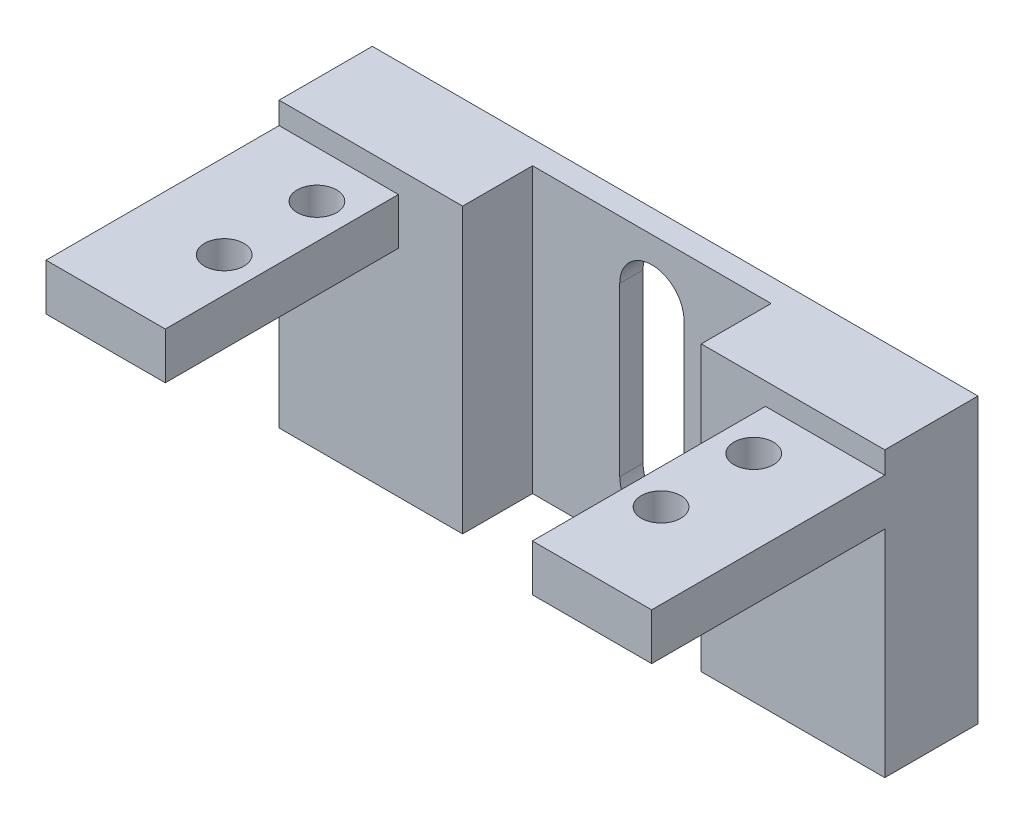
ISO-10303-21;
HEADER;
FILE_DESCRIPTION(('STEP AP214'),'2;1');
FILE_NAME('part.step','',(''),(''),'','','');
FILE_SCHEMA(('AUTOMOTIVE_DESIGN { 1 0 10303 214 1 1 1 1 }'));
ENDSEC;
DATA;
#1=APPLICATION_CONTEXT('core data for automotive mechanical design processes');
#2=APPLICATION_PROTOCOL_DEFINITION('international standard','automotive_design',2000,#1);
#3=PRODUCT_CONTEXT('',#1,'mechanical');
#4=PRODUCT('Part','Part','',(#3));
#5=PRODUCT_RELATED_PRODUCT_CATEGORY('part','',(#4));
#6=PRODUCT_DEFINITION_FORMATION('','',#4);
#7=PRODUCT_DEFINITION_CONTEXT('part definition',#1,'design');
#8=PRODUCT_DEFINITION('design','',#6,#7);
#9=PRODUCT_DEFINITION_SHAPE('','',#8);
#10=(LENGTH_UNIT() NAMED_UNIT(*) SI_UNIT(.MILLI.,.METRE.));
#11=(NAMED_UNIT(*) PLANE_ANGLE_UNIT() SI_UNIT($,.RADIAN.));
#12=(NAMED_UNIT(*) SI_UNIT($,.STERADIAN.) SOLID_ANGLE_UNIT());
#13=UNCERTAINTY_MEASURE_WITH_UNIT(LENGTH_MEASURE(1.E-05),#10,'distance_accuracy_value','');
#14=(GEOMETRIC_REPRESENTATION_CONTEXT(3) GLOBAL_UNCERTAINTY_ASSIGNED_CONTEXT((#13)) GLOBAL_UNIT_ASSIGNED_CONTEXT((#10,
#11,#12)) REPRESENTATION_CONTEXT('',''));
#15=CARTESIAN_POINT('',(0.,0.,0.));
#16=DIRECTION('',(0.,0.,1.));
#17=DIRECTION('',(1.,0.,0.));
#18=AXIS2_PLACEMENT_3D('',#15,#16,#17);
#19=CARTESIAN_POINT('',(0.,2.54,-27.619999878));
#20=DIRECTION('',(0.,0.,-1.));
#21=DIRECTION('',(-1.,0.,0.));
#22=AXIS2_PLACEMENT_3D('',#19,#20,#21);
#23=PLANE('',#22);
#24=DIRECTION('',(1.,0.,0.));
#25=VECTOR('',#24,1.);
#26=CARTESIAN_POINT('',(0.,0.,-27.619999878));
#27=LINE('',#26,#25);
#28=CARTESIAN_POINT('',(0.,0.,-27.619999878));
#29=VERTEX_POINT('',#28);
#30=CARTESIAN_POINT('',(66.,0.,-27.619999878));
#31=VERTEX_POINT('',#30);
#32=EDGE_CURVE('E347',#29,#31,#27,.T.);
#33=ORIENTED_EDGE('',*,*,#32,.F.);
#34=DIRECTION('',(0.,-1.,0.));
#35=VECTOR('',#34,1.);
#36=CARTESIAN_POINT('',(0.,2.54,-27.619999878));
#37=LINE('',#36,#35);
#38=CARTESIAN_POINT('',(0.,30.94,-27.619999878));
#39=VERTEX_POINT('',#38);
#40=EDGE_CURVE('E46',#39,#29,#37,.T.);
#41=ORIENTED_EDGE('',*,*,#40,.F.);
#42=DIRECTION('',(-1.,0.,0.));
#43=VECTOR('',#42,1.);
#44=CARTESIAN_POINT('',(0.,30.94,-27.619999878));
#45=LINE('',#44,#43);
#46=CARTESIAN_POINT('',(66.,30.94,-27.619999878));
#47=VERTEX_POINT('',#46);
#48=EDGE_CURVE('E234',#47,#39,#45,.T.);
#49=ORIENTED_EDGE('',*,*,#48,.F.);
#50=DIRECTION('',(0.,-1.,0.));
#51=VECTOR('',#50,1.);
#52=CARTESIAN_POINT('',(66.,2.54,-27.619999878));
#53=LINE('',#52,#51);
#54=EDGE_CURVE('E51',#47,#31,#53,.T.);
#55=ORIENTED_EDGE('',*,*,#54,.T.);
#56=EDGE_LOOP('',(#33,#41,#49,#55));
#57=FACE_BOUND('',#56,.T.);
#58=CARTESIAN_POINT('',(33.,6.35,-27.619999878));
#59=DIRECTION('',(0.,0.,-1.));
#60=DIRECTION('',(-1.,0.,0.));
#61=AXIS2_PLACEMENT_3D('',#58,#59,#60);
#62=CIRCLE('',#61,3.5);
#63=CARTESIAN_POINT('',(36.5,6.35,-27.619999878));
#64=VERTEX_POINT('',#63);
#65=CARTESIAN_POINT('',(29.5,6.35,-27.619999878));
#66=VERTEX_POINT('',#65);
#67=EDGE_CURVE('E196',#64,#66,#62,.T.);
#68=ORIENTED_EDGE('',*,*,#67,.F.);
#69=DIRECTION('',(0.,-1.,0.));
#70=VECTOR('',#69,1.);
#71=CARTESIAN_POINT('',(36.5,24.59,-27.619999878));
#72=LINE('',#71,#70);
#73=CARTESIAN_POINT('',(36.5,24.59,-27.619999878));
#74=VERTEX_POINT('',#73);
#75=EDGE_CURVE('E191',#74,#64,#72,.T.);
#76=ORIENTED_EDGE('',*,*,#75,.F.);
#77=CARTESIAN_POINT('',(33.,24.59,-27.619999878));
#78=DIRECTION('',(0.,0.,-1.));
#79=DIRECTION('',(-1.,0.,0.));
#80=AXIS2_PLACEMENT_3D('',#77,#78,#79);
#81=CIRCLE('',#80,3.5);
#82=CARTESIAN_POINT('',(29.5,24.59,-27.619999878));
#83=VERTEX_POINT('',#82);
#84=EDGE_CURVE('E180',#74,#83,#81,.F.);
#85=ORIENTED_EDGE('',*,*,#84,.T.);
#86=DIRECTION('',(0.,-1.,0.));
#87=VECTOR('',#86,1.);
#88=CARTESIAN_POINT('',(29.5,24.59,-27.619999878));
#89=LINE('',#88,#87);
#90=EDGE_CURVE('E200',#83,#66,#89,.T.);
#91=ORIENTED_EDGE('',*,*,#90,.T.);
#92=EDGE_LOOP('',(#68,#76,#85,#91));
#93=FACE_BOUND('',#92,.T.);
#94=ADVANCED_FACE('F42',(#57,#93),#23,.T.);
#95=CARTESIAN_POINT('',(20.,28.54,-25.079999878));
#96=DIRECTION('',(0.,0.,-1.));
#97=DIRECTION('',(-1.,0.,0.));
#98=AXIS2_PLACEMENT_3D('',#95,#96,#97);
#99=PLANE('',#98);
#100=DIRECTION('',(0.,-1.,0.));
#101=VECTOR('',#100,1.);
#102=CARTESIAN_POINT('',(20.,28.54,-25.079999878));
#103=LINE('',#102,#101);
#104=CARTESIAN_POINT('',(20.,30.94,-25.079999878));
#105=VERTEX_POINT('',#104);
#106=CARTESIAN_POINT('',(20.,0.,-25.079999878));
#107=VERTEX_POINT('',#106);
#108=EDGE_CURVE('E339',#105,#107,#103,.T.);
#109=ORIENTED_EDGE('',*,*,#108,.T.);
#110=DIRECTION('',(-1.,0.,0.));
#111=VECTOR('',#110,1.);
#112=CARTESIAN_POINT('',(20.,0.,-25.079999878));
#113=LINE('',#112,#111);
#114=CARTESIAN_POINT('',(46.,0.,-25.079999878));
#115=VERTEX_POINT('',#114);
#116=EDGE_CURVE('E275',#115,#107,#113,.T.);
#117=ORIENTED_EDGE('',*,*,#116,.F.);
#118=DIRECTION('',(0.,-1.,0.));
#119=VECTOR('',#118,1.);
#120=CARTESIAN_POINT('',(46.,28.54,-25.079999878));
#121=LINE('',#120,#119);
#122=CARTESIAN_POINT('',(46.,30.94,-25.079999878));
#123=VERTEX_POINT('',#122);
#124=EDGE_CURVE('E337',#123,#115,#121,.T.);
#125=ORIENTED_EDGE('',*,*,#124,.F.);
#126=DIRECTION('',(1.,0.,0.));
#127=VECTOR('',#126,1.);
#128=CARTESIAN_POINT('',(20.,30.94,-25.079999878));
#129=LINE('',#128,#127);
#130=EDGE_CURVE('E223',#105,#123,#129,.T.);
#131=ORIENTED_EDGE('',*,*,#130,.F.);
#132=EDGE_LOOP('',(#109,#117,#125,#131));
#133=FACE_BOUND('',#132,.T.);
#134=DIRECTION('',(0.,-1.,0.));
#135=VECTOR('',#134,1.);
#136=CARTESIAN_POINT('',(36.5,24.59,-25.079999878));
#137=LINE('',#136,#135);
#138=CARTESIAN_POINT('',(36.5,24.59,-25.079999878));
#139=VERTEX_POINT('',#138);
#140=CARTESIAN_POINT('',(36.5,6.35,-25.079999878));
#141=VERTEX_POINT('',#140);
#142=EDGE_CURVE('E67',#139,#141,#137,.T.);
#143=ORIENTED_EDGE('',*,*,#142,.T.);
#144=CARTESIAN_POINT('',(33.,6.35,-25.079999878));
#145=DIRECTION('',(0.,0.,-1.));
#146=DIRECTION('',(-1.,0.,0.));
#147=AXIS2_PLACEMENT_3D('',#144,#145,#146);
#148=CIRCLE('',#147,3.5);
#149=CARTESIAN_POINT('',(29.5,6.35,-25.079999878));
#150=VERTEX_POINT('',#149);
#151=EDGE_CURVE('E198',#141,#150,#148,.T.);
#152=ORIENTED_EDGE('',*,*,#151,.T.);
#153=DIRECTION('',(0.,-1.,0.));
#154=VECTOR('',#153,1.);
#155=CARTESIAN_POINT('',(29.5,24.59,-25.079999878));
#156=LINE('',#155,#154);
#157=CARTESIAN_POINT('',(29.5,24.59,-25.079999878));
#158=VERTEX_POINT('',#157);
#159=EDGE_CURVE('E206',#158,#150,#156,.T.);
#160=ORIENTED_EDGE('',*,*,#159,.F.);
#161=CARTESIAN_POINT('',(33.,24.59,-25.079999878));
#162=DIRECTION('',(0.,0.,1.));
#163=DIRECTION('',(1.,0.,0.));
#164=AXIS2_PLACEMENT_3D('',#161,#162,#163);
#165=CIRCLE('',#164,3.5);
#166=EDGE_CURVE('E193',#139,#158,#165,.T.);
#167=ORIENTED_EDGE('',*,*,#166,.F.);
#168=EDGE_LOOP('',(#143,#152,#160,#167));
#169=FACE_BOUND('',#168,.T.);
#170=ADVANCED_FACE('F405',(#133,#169),#99,.F.);
#171=CARTESIAN_POINT('',(0.,28.54,0.));
#172=DIRECTION('',(0.,1.,0.));
#173=DIRECTION('',(0.,0.,1.));
#174=AXIS2_PLACEMENT_3D('',#171,#172,#173);
#175=PLANE('',#174);
#176=DIRECTION('',(1.,0.,0.));
#177=VECTOR('',#176,1.);
#178=CARTESIAN_POINT('',(46.,28.54,-17.459999878));
#179=LINE('',#178,#177);
#180=CARTESIAN_POINT('',(53.,28.54,-17.459999878));
#181=VERTEX_POINT('',#180);
#182=CARTESIAN_POINT('',(66.,28.54,-17.459999878));
#183=VERTEX_POINT('',#182);
#184=EDGE_CURVE('E11',#181,#183,#179,.T.);
#185=ORIENTED_EDGE('',*,*,#184,.F.);
#186=DIRECTION('',(0.,0.,-1.));
#187=VECTOR('',#186,1.);
#188=CARTESIAN_POINT('',(53.,28.54,7.940000122));
#189=LINE('',#188,#187);
#190=CARTESIAN_POINT('',(53.,28.54,7.940000122));
#191=VERTEX_POINT('',#190);
#192=EDGE_CURVE('E284',#191,#181,#189,.T.);
#193=ORIENTED_EDGE('',*,*,#192,.F.);
#194=DIRECTION('',(-1.,0.,0.));
#195=VECTOR('',#194,1.);
#196=CARTESIAN_POINT('',(66.,28.54,7.940000122));
#197=LINE('',#196,#195);
#198=CARTESIAN_POINT('',(66.,28.54,7.940000122));
#199=VERTEX_POINT('',#198);
#200=EDGE_CURVE('E305',#199,#191,#197,.T.);
#201=ORIENTED_EDGE('',*,*,#200,.F.);
#202=DIRECTION('',(0.,0.,1.));
#203=VECTOR('',#202,1.);
#204=CARTESIAN_POINT('',(66.,28.54,-27.619999878));
#205=LINE('',#204,#203);
#206=EDGE_CURVE('E331',#183,#199,#205,.T.);
#207=ORIENTED_EDGE('',*,*,#206,.F.);
#208=EDGE_LOOP('',(#185,#193,#201,#207));
#209=FACE_BOUND('',#208,.T.);
#210=CARTESIAN_POINT('',(56.8,28.54,-2.279999878));
#211=DIRECTION('',(0.,1.,0.));
#212=DIRECTION('',(0.,0.,1.));
#213=AXIS2_PLACEMENT_3D('',#210,#211,#212);
#214=CIRCLE('',#213,2.15);
#215=CARTESIAN_POINT('',(56.8,28.54,-0.129999877999994));
#216=VERTEX_POINT('',#215);
#217=EDGE_CURVE('E262',#216,#216,#214,.T.);
#218=ORIENTED_EDGE('',*,*,#217,.F.);
#219=EDGE_LOOP('',(#218));
#220=FACE_BOUND('',#219,.T.);
#221=CARTESIAN_POINT('',(56.8,28.54,-12.379999878));
#222=DIRECTION('',(0.,1.,0.));
#223=DIRECTION('',(0.,0.,1.));
#224=AXIS2_PLACEMENT_3D('',#221,#222,#223);
#225=CIRCLE('',#224,2.15);
#226=CARTESIAN_POINT('',(56.8,28.54,-10.229999878));
#227=VERTEX_POINT('',#226);
#228=EDGE_CURVE('E258',#227,#227,#225,.T.);
#229=ORIENTED_EDGE('',*,*,#228,.F.);
#230=EDGE_LOOP('',(#229));
#231=FACE_BOUND('',#230,.T.);
#232=ADVANCED_FACE('F412',(#209,#220,#231),#175,.T.);
#233=CARTESIAN_POINT('',(66.,28.54,-17.459999878));
#234=DIRECTION('',(0.,0.,1.));
#235=DIRECTION('',(1.,0.,0.));
#236=AXIS2_PLACEMENT_3D('',#233,#234,#235);
#237=PLANE('',#236);
#238=DIRECTION('',(1.,0.,0.));
#239=VECTOR('',#238,1.);
#240=CARTESIAN_POINT('',(66.,23.46,-17.459999878));
#241=LINE('',#240,#239);
#242=CARTESIAN_POINT('',(53.,23.46,-17.459999878));
#243=VERTEX_POINT('',#242);
#244=CARTESIAN_POINT('',(66.,23.46,-17.459999878));
#245=VERTEX_POINT('',#244);
#246=EDGE_CURVE('E294',#243,#245,#241,.T.);
#247=ORIENTED_EDGE('',*,*,#246,.F.);
#248=DIRECTION('',(0.,-1.,0.));
#249=VECTOR('',#248,1.);
#250=CARTESIAN_POINT('',(53.,28.54,-17.459999878));
#251=LINE('',#250,#249);
#252=EDGE_CURVE('E297',#181,#243,#251,.T.);
#253=ORIENTED_EDGE('',*,*,#252,.F.);
#254=ORIENTED_EDGE('',*,*,#184,.T.);
#255=DIRECTION('',(0.,-1.,0.));
#256=VECTOR('',#255,1.);
#257=CARTESIAN_POINT('',(66.,30.94,-17.459999878));
#258=LINE('',#257,#256);
#259=CARTESIAN_POINT('',(66.,30.94,-17.459999878));
#260=VERTEX_POINT('',#259);
#261=EDGE_CURVE('E237',#260,#183,#258,.T.);
#262=ORIENTED_EDGE('',*,*,#261,.F.);
#263=DIRECTION('',(1.,0.,0.));
#264=VECTOR('',#263,1.);
#265=CARTESIAN_POINT('',(46.,30.94,-17.459999878));
#266=LINE('',#265,#264);
#267=CARTESIAN_POINT('',(46.,30.94,-17.459999878));
#268=VERTEX_POINT('',#267);
#269=EDGE_CURVE('E229',#268,#260,#266,.T.);
#270=ORIENTED_EDGE('',*,*,#269,.F.);
#271=DIRECTION('',(0.,-1.,0.));
#272=VECTOR('',#271,1.);
#273=CARTESIAN_POINT('',(46.,28.54,-17.459999878));
#274=LINE('',#273,#272);
#275=CARTESIAN_POINT('',(46.,0.,-17.459999878));
#276=VERTEX_POINT('',#275);
#277=EDGE_CURVE('E335',#268,#276,#274,.T.);
#278=ORIENTED_EDGE('',*,*,#277,.T.);
#279=DIRECTION('',(-1.,0.,0.));
#280=VECTOR('',#279,1.);
#281=CARTESIAN_POINT('',(46.,0.,-17.459999878));
#282=LINE('',#281,#280);
#283=CARTESIAN_POINT('',(66.,0.,-17.459999878));
#284=VERTEX_POINT('',#283);
#285=EDGE_CURVE('E265',#284,#276,#282,.T.);
#286=ORIENTED_EDGE('',*,*,#285,.F.);
#287=DIRECTION('',(0.,-1.,0.));
#288=VECTOR('',#287,1.);
#289=CARTESIAN_POINT('',(66.,28.54,-17.459999878));
#290=LINE('',#289,#288);
#291=EDGE_CURVE('E333',#245,#284,#290,.T.);
#292=ORIENTED_EDGE('',*,*,#291,.F.);
#293=EDGE_LOOP('',(#247,#253,#254,#262,#270,#278,#286,#292));
#294=FACE_BOUND('',#293,.T.);
#295=ADVANCED_FACE('F397',(#294),#237,.T.);
#296=CARTESIAN_POINT('',(0.,28.54,-17.459999878));
#297=DIRECTION('',(0.,0.,-1.));
#298=DIRECTION('',(-1.,0.,0.));
#299=AXIS2_PLACEMENT_3D('',#296,#297,#298);
#300=PLANE('',#299);
#301=DIRECTION('',(1.,0.,0.));
#302=VECTOR('',#301,1.);
#303=CARTESIAN_POINT('',(0.,23.46,-17.459999878));
#304=LINE('',#303,#302);
#305=CARTESIAN_POINT('',(0.,23.46,-17.459999878));
#306=VERTEX_POINT('',#305);
#307=CARTESIAN_POINT('',(13.,23.46,-17.459999878));
#308=VERTEX_POINT('',#307);
#309=EDGE_CURVE('E301',#306,#308,#304,.T.);
#310=ORIENTED_EDGE('',*,*,#309,.F.);
#311=DIRECTION('',(0.,-1.,0.));
#312=VECTOR('',#311,1.);
#313=CARTESIAN_POINT('',(0.,28.54,-17.459999878));
#314=LINE('',#313,#312);
#315=CARTESIAN_POINT('',(0.,0.,-17.459999878));
#316=VERTEX_POINT('',#315);
#317=EDGE_CURVE('E343',#306,#316,#314,.T.);
#318=ORIENTED_EDGE('',*,*,#317,.T.);
#319=DIRECTION('',(-1.,0.,0.));
#320=VECTOR('',#319,1.);
#321=CARTESIAN_POINT('',(0.,0.,-17.459999878));
#322=LINE('',#321,#320);
#323=CARTESIAN_POINT('',(20.,0.,-17.459999878));
#324=VERTEX_POINT('',#323);
#325=EDGE_CURVE('E281',#324,#316,#322,.T.);
#326=ORIENTED_EDGE('',*,*,#325,.F.);
#327=DIRECTION('',(0.,-1.,0.));
#328=VECTOR('',#327,1.);
#329=CARTESIAN_POINT('',(20.,28.54,-17.459999878));
#330=LINE('',#329,#328);
#331=CARTESIAN_POINT('',(20.,30.94,-17.459999878));
#332=VERTEX_POINT('',#331);
#333=EDGE_CURVE('E341',#332,#324,#330,.T.);
#334=ORIENTED_EDGE('',*,*,#333,.F.);
#335=DIRECTION('',(1.,0.,0.));
#336=VECTOR('',#335,1.);
#337=CARTESIAN_POINT('',(20.,30.94,-17.459999878));
#338=LINE('',#337,#336);
#339=CARTESIAN_POINT('',(0.,30.94,-17.459999878));
#340=VERTEX_POINT('',#339);
#341=EDGE_CURVE('E217',#340,#332,#338,.T.);
#342=ORIENTED_EDGE('',*,*,#341,.F.);
#343=DIRECTION('',(0.,-1.,0.));
#344=VECTOR('',#343,1.);
#345=CARTESIAN_POINT('',(0.,30.94,-17.459999878));
#346=LINE('',#345,#344);
#347=CARTESIAN_POINT('',(0.,28.54,-17.459999878));
#348=VERTEX_POINT('',#347);
#349=EDGE_CURVE('E242',#340,#348,#346,.T.);
#350=ORIENTED_EDGE('',*,*,#349,.T.);
#351=DIRECTION('',(1.,0.,0.));
#352=VECTOR('',#351,1.);
#353=CARTESIAN_POINT('',(20.,28.54,-17.459999878));
#354=LINE('',#353,#352);
#355=CARTESIAN_POINT('',(13.,28.54,-17.459999878));
#356=VERTEX_POINT('',#355);
#357=EDGE_CURVE('E187',#348,#356,#354,.T.);
#358=ORIENTED_EDGE('',*,*,#357,.T.);
#359=DIRECTION('',(0.,1.,0.));
#360=VECTOR('',#359,1.);
#361=CARTESIAN_POINT('',(13.,28.54,-17.459999878));
#362=LINE('',#361,#360);
#363=EDGE_CURVE('E313',#308,#356,#362,.T.);
#364=ORIENTED_EDGE('',*,*,#363,.F.);
#365=EDGE_LOOP('',(#310,#318,#326,#334,#342,#350,#358,#364));
#366=FACE_BOUND('',#365,.T.);
#367=ADVANCED_FACE('F368',(#366),#300,.F.);
#368=CARTESIAN_POINT('',(0.,2.54,0.));
#369=DIRECTION('',(-1.,0.,0.));
#370=DIRECTION('',(0.,0.,1.));
#371=AXIS2_PLACEMENT_3D('',#368,#369,#370);
#372=PLANE('',#371);
#373=DIRECTION('',(0.,0.,-1.));
#374=VECTOR('',#373,1.);
#375=CARTESIAN_POINT('',(0.,0.,0.));
#376=LINE('',#375,#374);
#377=EDGE_CURVE('E345',#316,#29,#376,.T.);
#378=ORIENTED_EDGE('',*,*,#377,.F.);
#379=ORIENTED_EDGE('',*,*,#317,.F.);
#380=DIRECTION('',(0.,0.,-1.));
#381=VECTOR('',#380,1.);
#382=CARTESIAN_POINT('',(0.,23.46,7.940000122));
#383=LINE('',#382,#381);
#384=CARTESIAN_POINT('',(0.,23.46,7.940000122));
#385=VERTEX_POINT('',#384);
#386=EDGE_CURVE('E327',#385,#306,#383,.T.);
#387=ORIENTED_EDGE('',*,*,#386,.F.);
#388=DIRECTION('',(0.,-1.,0.));
#389=VECTOR('',#388,1.);
#390=CARTESIAN_POINT('',(0.,28.54,7.940000122));
#391=LINE('',#390,#389);
#392=CARTESIAN_POINT('',(0.,28.54,7.940000122));
#393=VERTEX_POINT('',#392);
#394=EDGE_CURVE('E312',#393,#385,#391,.T.);
#395=ORIENTED_EDGE('',*,*,#394,.F.);
#396=DIRECTION('',(0.,0.,1.));
#397=VECTOR('',#396,1.);
#398=CARTESIAN_POINT('',(0.,28.54,-27.619999878));
#399=LINE('',#398,#397);
#400=EDGE_CURVE('E329',#348,#393,#399,.T.);
#401=ORIENTED_EDGE('',*,*,#400,.F.);
#402=ORIENTED_EDGE('',*,*,#349,.F.);
#403=DIRECTION('',(0.,0.,1.));
#404=VECTOR('',#403,1.);
#405=CARTESIAN_POINT('',(0.,30.94,-27.619999878));
#406=LINE('',#405,#404);
#407=EDGE_CURVE('E214',#39,#340,#406,.T.);
#408=ORIENTED_EDGE('',*,*,#407,.F.);
#409=ORIENTED_EDGE('',*,*,#40,.T.);
#410=EDGE_LOOP('',(#378,#379,#387,#395,#401,#402,#408,#409));
#411=FACE_BOUND('',#410,.T.);
#412=ADVANCED_FACE('F44',(#411),#372,.T.);
#413=CARTESIAN_POINT('',(66.,2.54,0.));
#414=DIRECTION('',(-1.,0.,0.));
#415=DIRECTION('',(0.,0.,1.));
#416=AXIS2_PLACEMENT_3D('',#413,#414,#415);
#417=PLANE('',#416);
#418=ORIENTED_EDGE('',*,*,#291,.T.);
#419=DIRECTION('',(0.,0.,-1.));
#420=VECTOR('',#419,1.);
#421=CARTESIAN_POINT('',(66.,0.,0.));
#422=LINE('',#421,#420);
#423=EDGE_CURVE('E350',#284,#31,#422,.T.);
#424=ORIENTED_EDGE('',*,*,#423,.T.);
#425=ORIENTED_EDGE('',*,*,#54,.F.);
#426=DIRECTION('',(0.,0.,-1.));
#427=VECTOR('',#426,1.);
#428=CARTESIAN_POINT('',(66.,30.94,-27.619999878));
#429=LINE('',#428,#427);
#430=EDGE_CURVE('E231',#260,#47,#429,.T.);
#431=ORIENTED_EDGE('',*,*,#430,.F.);
#432=ORIENTED_EDGE('',*,*,#261,.T.);
#433=ORIENTED_EDGE('',*,*,#206,.T.);
#434=DIRECTION('',(0.,1.,0.));
#435=VECTOR('',#434,1.);
#436=CARTESIAN_POINT('',(66.,28.54,7.940000122));
#437=LINE('',#436,#435);
#438=CARTESIAN_POINT('',(66.,23.46,7.940000122));
#439=VERTEX_POINT('',#438);
#440=EDGE_CURVE('E298',#439,#199,#437,.T.);
#441=ORIENTED_EDGE('',*,*,#440,.F.);
#442=DIRECTION('',(0.,0.,-1.));
#443=VECTOR('',#442,1.);
#444=CARTESIAN_POINT('',(66.,23.46,7.940000122));
#445=LINE('',#444,#443);
#446=EDGE_CURVE('E290',#439,#245,#445,.T.);
#447=ORIENTED_EDGE('',*,*,#446,.T.);
#448=EDGE_LOOP('',(#418,#424,#425,#431,#432,#433,#441,#447));
#449=FACE_BOUND('',#448,.T.);
#450=ADVANCED_FACE('F392',(#449),#417,.F.);
#451=CARTESIAN_POINT('',(0.,0.,0.));
#452=DIRECTION('',(0.,-1.,0.));
#453=DIRECTION('',(0.,0.,-1.));
#454=AXIS2_PLACEMENT_3D('',#451,#452,#453);
#455=PLANE('',#454);
#456=ORIENTED_EDGE('',*,*,#325,.T.);
#457=ORIENTED_EDGE('',*,*,#377,.T.);
#458=ORIENTED_EDGE('',*,*,#32,.T.);
#459=ORIENTED_EDGE('',*,*,#423,.F.);
#460=ORIENTED_EDGE('',*,*,#285,.T.);
#461=DIRECTION('',(0.,0.,-1.));
#462=VECTOR('',#461,1.);
#463=CARTESIAN_POINT('',(46.,0.,-25.079999878));
#464=LINE('',#463,#462);
#465=EDGE_CURVE('E272',#276,#115,#464,.T.);
#466=ORIENTED_EDGE('',*,*,#465,.T.);
#467=ORIENTED_EDGE('',*,*,#116,.T.);
#468=DIRECTION('',(0.,0.,1.));
#469=VECTOR('',#468,1.);
#470=CARTESIAN_POINT('',(20.,0.,-25.079999878));
#471=LINE('',#470,#469);
#472=EDGE_CURVE('E278',#107,#324,#471,.T.);
#473=ORIENTED_EDGE('',*,*,#472,.T.);
#474=EDGE_LOOP('',(#456,#457,#458,#459,#460,#466,#467,#473));
#475=FACE_BOUND('',#474,.T.);
#476=ADVANCED_FACE('F363',(#475),#455,.T.);
#477=CARTESIAN_POINT('',(20.,28.54,-17.459999878));
#478=DIRECTION('',(-1.,0.,0.));
#479=DIRECTION('',(0.,0.,1.));
#480=AXIS2_PLACEMENT_3D('',#477,#478,#479);
#481=PLANE('',#480);
#482=ORIENTED_EDGE('',*,*,#333,.T.);
#483=ORIENTED_EDGE('',*,*,#472,.F.);
#484=ORIENTED_EDGE('',*,*,#108,.F.);
#485=DIRECTION('',(0.,0.,-1.));
#486=VECTOR('',#485,1.);
#487=CARTESIAN_POINT('',(20.,30.94,-25.079999878));
#488=LINE('',#487,#486);
#489=EDGE_CURVE('E220',#332,#105,#488,.T.);
#490=ORIENTED_EDGE('',*,*,#489,.F.);
#491=EDGE_LOOP('',(#482,#483,#484,#490));
#492=FACE_BOUND('',#491,.T.);
#493=ADVANCED_FACE('F408',(#492),#481,.F.);
#494=CARTESIAN_POINT('',(46.,28.54,-17.459999878));
#495=DIRECTION('',(-1.,0.,0.));
#496=DIRECTION('',(0.,0.,1.));
#497=AXIS2_PLACEMENT_3D('',#494,#495,#496);
#498=PLANE('',#497);
#499=ORIENTED_EDGE('',*,*,#124,.T.);
#500=ORIENTED_EDGE('',*,*,#465,.F.);
#501=ORIENTED_EDGE('',*,*,#277,.F.);
#502=DIRECTION('',(0.,0.,1.));
#503=VECTOR('',#502,1.);
#504=CARTESIAN_POINT('',(46.,30.94,-25.079999878));
#505=LINE('',#504,#503);
#506=EDGE_CURVE('E226',#123,#268,#505,.T.);
#507=ORIENTED_EDGE('',*,*,#506,.F.);
#508=EDGE_LOOP('',(#499,#500,#501,#507));
#509=FACE_BOUND('',#508,.T.);
#510=ADVANCED_FACE('F401',(#509),#498,.T.);
#511=ORIENTED_EDGE('',*,*,#357,.F.);
#512=ORIENTED_EDGE('',*,*,#400,.T.);
#513=DIRECTION('',(-1.,0.,0.));
#514=VECTOR('',#513,1.);
#515=CARTESIAN_POINT('',(0.,28.54,7.940000122));
#516=LINE('',#515,#514);
#517=CARTESIAN_POINT('',(13.,28.54,7.940000122));
#518=VERTEX_POINT('',#517);
#519=EDGE_CURVE('E309',#518,#393,#516,.T.);
#520=ORIENTED_EDGE('',*,*,#519,.F.);
#521=DIRECTION('',(0.,0.,-1.));
#522=VECTOR('',#521,1.);
#523=CARTESIAN_POINT('',(13.,28.54,7.940000122));
#524=LINE('',#523,#522);
#525=EDGE_CURVE('E319',#518,#356,#524,.T.);
#526=ORIENTED_EDGE('',*,*,#525,.T.);
#527=EDGE_LOOP('',(#511,#512,#520,#526));
#528=FACE_BOUND('',#527,.T.);
#529=CARTESIAN_POINT('',(9.2,28.54,-12.379999878));
#530=DIRECTION('',(0.,-1.,0.));
#531=DIRECTION('',(0.,0.,1.));
#532=AXIS2_PLACEMENT_3D('',#529,#530,#531);
#533=CIRCLE('',#532,2.15);
#534=CARTESIAN_POINT('',(9.2,28.54,-10.229999878));
#535=VERTEX_POINT('',#534);
#536=EDGE_CURVE('E246',#535,#535,#533,.T.);
#537=ORIENTED_EDGE('',*,*,#536,.T.);
#538=EDGE_LOOP('',(#537));
#539=FACE_BOUND('',#538,.T.);
#540=CARTESIAN_POINT('',(9.2,28.54,-2.279999878));
#541=DIRECTION('',(0.,-1.,0.));
#542=DIRECTION('',(0.,0.,1.));
#543=AXIS2_PLACEMENT_3D('',#540,#541,#542);
#544=CIRCLE('',#543,2.15);
#545=CARTESIAN_POINT('',(9.2,28.54,-0.129999877999994));
#546=VERTEX_POINT('',#545);
#547=EDGE_CURVE('E253',#546,#546,#544,.T.);
#548=ORIENTED_EDGE('',*,*,#547,.T.);
#549=EDGE_LOOP('',(#548));
#550=FACE_BOUND('',#549,.T.);
#551=ADVANCED_FACE('F383',(#528,#539,#550),#175,.T.);
#552=CARTESIAN_POINT('',(0.,23.46,7.940000122));
#553=DIRECTION('',(0.,1.,0.));
#554=DIRECTION('',(0.,0.,1.));
#555=AXIS2_PLACEMENT_3D('',#552,#553,#554);
#556=PLANE('',#555);
#557=CARTESIAN_POINT('',(9.2,23.46,-12.379999878));
#558=DIRECTION('',(0.,1.,0.));
#559=DIRECTION('',(0.,0.,1.));
#560=AXIS2_PLACEMENT_3D('',#557,#558,#559);
#561=CIRCLE('',#560,2.15);
#562=CARTESIAN_POINT('',(9.2,23.46,-10.229999878));
#563=VERTEX_POINT('',#562);
#564=EDGE_CURVE('E250',#563,#563,#561,.T.);
#565=ORIENTED_EDGE('',*,*,#564,.T.);
#566=EDGE_LOOP('',(#565));
#567=FACE_BOUND('',#566,.T.);
#568=CARTESIAN_POINT('',(9.2,23.46,-2.279999878));
#569=DIRECTION('',(0.,1.,0.));
#570=DIRECTION('',(0.,0.,1.));
#571=AXIS2_PLACEMENT_3D('',#568,#569,#570);
#572=CIRCLE('',#571,2.15);
#573=CARTESIAN_POINT('',(9.2,23.46,-0.129999877999994));
#574=VERTEX_POINT('',#573);
#575=EDGE_CURVE('E245',#574,#574,#572,.T.);
#576=ORIENTED_EDGE('',*,*,#575,.T.);
#577=EDGE_LOOP('',(#576));
#578=FACE_BOUND('',#577,.T.);
#579=ORIENTED_EDGE('',*,*,#309,.T.);
#580=DIRECTION('',(0.,0.,-1.));
#581=VECTOR('',#580,1.);
#582=CARTESIAN_POINT('',(13.,23.46,7.940000122));
#583=LINE('',#582,#581);
#584=CARTESIAN_POINT('',(13.,23.46,7.940000122));
#585=VERTEX_POINT('',#584);
#586=EDGE_CURVE('E324',#585,#308,#583,.T.);
#587=ORIENTED_EDGE('',*,*,#586,.F.);
#588=DIRECTION('',(1.,0.,0.));
#589=VECTOR('',#588,1.);
#590=CARTESIAN_POINT('',(0.,23.46,7.940000122));
#591=LINE('',#590,#589);
#592=EDGE_CURVE('E315',#385,#585,#591,.T.);
#593=ORIENTED_EDGE('',*,*,#592,.F.);
#594=ORIENTED_EDGE('',*,*,#386,.T.);
#595=EDGE_LOOP('',(#579,#587,#593,#594));
#596=FACE_BOUND('',#595,.T.);
#597=ADVANCED_FACE('F376',(#567,#578,#596),#556,.F.);
#598=CARTESIAN_POINT('',(13.,28.54,7.940000122));
#599=DIRECTION('',(-1.,0.,0.));
#600=DIRECTION('',(0.,0.,1.));
#601=AXIS2_PLACEMENT_3D('',#598,#599,#600);
#602=PLANE('',#601);
#603=ORIENTED_EDGE('',*,*,#363,.T.);
#604=ORIENTED_EDGE('',*,*,#525,.F.);
#605=DIRECTION('',(0.,1.,0.));
#606=VECTOR('',#605,1.);
#607=CARTESIAN_POINT('',(13.,28.54,7.940000122));
#608=LINE('',#607,#606);
#609=EDGE_CURVE('E317',#585,#518,#608,.T.);
#610=ORIENTED_EDGE('',*,*,#609,.F.);
#611=ORIENTED_EDGE('',*,*,#586,.T.);
#612=EDGE_LOOP('',(#603,#604,#610,#611));
#613=FACE_BOUND('',#612,.T.);
#614=ADVANCED_FACE('F432',(#613),#602,.F.);
#615=CARTESIAN_POINT('',(0.,0.,7.940000122));
#616=DIRECTION('',(0.,0.,-1.));
#617=DIRECTION('',(-1.,0.,0.));
#618=AXIS2_PLACEMENT_3D('',#615,#616,#617);
#619=PLANE('',#618);
#620=ORIENTED_EDGE('',*,*,#519,.T.);
#621=ORIENTED_EDGE('',*,*,#394,.T.);
#622=ORIENTED_EDGE('',*,*,#592,.T.);
#623=ORIENTED_EDGE('',*,*,#609,.T.);
#624=EDGE_LOOP('',(#620,#621,#622,#623));
#625=FACE_BOUND('',#624,.T.);
#626=ADVANCED_FACE('F379',(#625),#619,.F.);
#627=CARTESIAN_POINT('',(53.,28.54,7.940000122));
#628=DIRECTION('',(1.,0.,0.));
#629=DIRECTION('',(0.,0.,-1.));
#630=AXIS2_PLACEMENT_3D('',#627,#628,#629);
#631=PLANE('',#630);
#632=ORIENTED_EDGE('',*,*,#252,.T.);
#633=DIRECTION('',(0.,0.,-1.));
#634=VECTOR('',#633,1.);
#635=CARTESIAN_POINT('',(53.,23.46,7.940000122));
#636=LINE('',#635,#634);
#637=CARTESIAN_POINT('',(53.,23.46,7.940000122));
#638=VERTEX_POINT('',#637);
#639=EDGE_CURVE('E287',#638,#243,#636,.T.);
#640=ORIENTED_EDGE('',*,*,#639,.F.);
#641=DIRECTION('',(0.,-1.,0.));
#642=VECTOR('',#641,1.);
#643=CARTESIAN_POINT('',(53.,28.54,7.940000122));
#644=LINE('',#643,#642);
#645=EDGE_CURVE('E303',#191,#638,#644,.T.);
#646=ORIENTED_EDGE('',*,*,#645,.F.);
#647=ORIENTED_EDGE('',*,*,#192,.T.);
#648=EDGE_LOOP('',(#632,#640,#646,#647));
#649=FACE_BOUND('',#648,.T.);
#650=ADVANCED_FACE('F423',(#649),#631,.F.);
#651=CARTESIAN_POINT('',(66.,23.46,7.940000122));
#652=DIRECTION('',(0.,1.,0.));
#653=DIRECTION('',(0.,0.,1.));
#654=AXIS2_PLACEMENT_3D('',#651,#652,#653);
#655=PLANE('',#654);
#656=CARTESIAN_POINT('',(56.8,23.46,-12.379999878));
#657=DIRECTION('',(0.,1.,0.));
#658=DIRECTION('',(0.,0.,1.));
#659=AXIS2_PLACEMENT_3D('',#656,#657,#658);
#660=CIRCLE('',#659,2.15);
#661=CARTESIAN_POINT('',(56.8,23.46,-10.229999878));
#662=VERTEX_POINT('',#661);
#663=EDGE_CURVE('E261',#662,#662,#660,.F.);
#664=ORIENTED_EDGE('',*,*,#663,.F.);
#665=EDGE_LOOP('',(#664));
#666=FACE_BOUND('',#665,.T.);
#667=CARTESIAN_POINT('',(56.8,23.46,-2.279999878));
#668=DIRECTION('',(0.,1.,0.));
#669=DIRECTION('',(0.,0.,1.));
#670=AXIS2_PLACEMENT_3D('',#667,#668,#669);
#671=CIRCLE('',#670,2.15);
#672=CARTESIAN_POINT('',(56.8,23.46,-0.129999877999994));
#673=VERTEX_POINT('',#672);
#674=EDGE_CURVE('E249',#673,#673,#671,.F.);
#675=ORIENTED_EDGE('',*,*,#674,.F.);
#676=EDGE_LOOP('',(#675));
#677=FACE_BOUND('',#676,.T.);
#678=ORIENTED_EDGE('',*,*,#246,.T.);
#679=ORIENTED_EDGE('',*,*,#446,.F.);
#680=DIRECTION('',(1.,0.,0.));
#681=VECTOR('',#680,1.);
#682=CARTESIAN_POINT('',(66.,23.46,7.940000122));
#683=LINE('',#682,#681);
#684=EDGE_CURVE('E293',#638,#439,#683,.T.);
#685=ORIENTED_EDGE('',*,*,#684,.F.);
#686=ORIENTED_EDGE('',*,*,#639,.T.);
#687=EDGE_LOOP('',(#678,#679,#685,#686));
#688=FACE_BOUND('',#687,.T.);
#689=ADVANCED_FACE('F421',(#666,#677,#688),#655,.F.);
#690=CARTESIAN_POINT('',(0.,0.,7.940000122));
#691=DIRECTION('',(0.,0.,-1.));
#692=DIRECTION('',(-1.,0.,0.));
#693=AXIS2_PLACEMENT_3D('',#690,#691,#692);
#694=PLANE('',#693);
#695=ORIENTED_EDGE('',*,*,#440,.T.);
#696=ORIENTED_EDGE('',*,*,#200,.T.);
#697=ORIENTED_EDGE('',*,*,#645,.T.);
#698=ORIENTED_EDGE('',*,*,#684,.T.);
#699=EDGE_LOOP('',(#695,#696,#697,#698));
#700=FACE_BOUND('',#699,.T.);
#701=ADVANCED_FACE('F417',(#700),#694,.F.);
#702=CARTESIAN_POINT('',(56.8,-0.001000000000001,-2.279999878));
#703=DIRECTION('',(0.,1.,0.));
#704=DIRECTION('',(0.,0.,1.));
#705=AXIS2_PLACEMENT_3D('',#702,#703,#704);
#706=CYLINDRICAL_SURFACE('',#705,2.15);
#707=ORIENTED_EDGE('',*,*,#217,.T.);
#708=EDGE_LOOP('',(#707));
#709=FACE_BOUND('',#708,.T.);
#710=ORIENTED_EDGE('',*,*,#674,.T.);
#711=EDGE_LOOP('',(#710));
#712=FACE_BOUND('',#711,.T.);
#713=ADVANCED_FACE('F462',(#709,#712),#706,.F.);
#714=CARTESIAN_POINT('',(56.8,-0.001000000000001,-12.379999878));
#715=DIRECTION('',(0.,1.,0.));
#716=DIRECTION('',(0.,0.,1.));
#717=AXIS2_PLACEMENT_3D('',#714,#715,#716);
#718=CYLINDRICAL_SURFACE('',#717,2.15);
#719=ORIENTED_EDGE('',*,*,#228,.T.);
#720=EDGE_LOOP('',(#719));
#721=FACE_BOUND('',#720,.T.);
#722=ORIENTED_EDGE('',*,*,#663,.T.);
#723=EDGE_LOOP('',(#722));
#724=FACE_BOUND('',#723,.T.);
#725=ADVANCED_FACE('F466',(#721,#724),#718,.F.);
#726=CARTESIAN_POINT('',(9.2,-0.001000000000001,-2.279999878));
#727=DIRECTION('',(0.,1.,0.));
#728=DIRECTION('',(0.,0.,1.));
#729=AXIS2_PLACEMENT_3D('',#726,#727,#728);
#730=CYLINDRICAL_SURFACE('',#729,2.15);
#731=ORIENTED_EDGE('',*,*,#547,.F.);
#732=EDGE_LOOP('',(#731));
#733=FACE_BOUND('',#732,.T.);
#734=ORIENTED_EDGE('',*,*,#575,.F.);
#735=EDGE_LOOP('',(#734));
#736=FACE_BOUND('',#735,.T.);
#737=ADVANCED_FACE('F471',(#733,#736),#730,.F.);
#738=CARTESIAN_POINT('',(9.2,-0.001000000000001,-12.379999878));
#739=DIRECTION('',(0.,1.,0.));
#740=DIRECTION('',(0.,0.,1.));
#741=AXIS2_PLACEMENT_3D('',#738,#739,#740);
#742=CYLINDRICAL_SURFACE('',#741,2.15);
#743=ORIENTED_EDGE('',*,*,#536,.F.);
#744=EDGE_LOOP('',(#743));
#745=FACE_BOUND('',#744,.T.);
#746=ORIENTED_EDGE('',*,*,#564,.F.);
#747=EDGE_LOOP('',(#746));
#748=FACE_BOUND('',#747,.T.);
#749=ADVANCED_FACE('F478',(#745,#748),#742,.F.);
#750=CARTESIAN_POINT('',(0.,30.94,0.));
#751=DIRECTION('',(0.,-1.,0.));
#752=DIRECTION('',(0.,0.,-1.));
#753=AXIS2_PLACEMENT_3D('',#750,#751,#752);
#754=PLANE('',#753);
#755=ORIENTED_EDGE('',*,*,#407,.T.);
#756=ORIENTED_EDGE('',*,*,#341,.T.);
#757=ORIENTED_EDGE('',*,*,#489,.T.);
#758=ORIENTED_EDGE('',*,*,#130,.T.);
#759=ORIENTED_EDGE('',*,*,#506,.T.);
#760=ORIENTED_EDGE('',*,*,#269,.T.);
#761=ORIENTED_EDGE('',*,*,#430,.T.);
#762=ORIENTED_EDGE('',*,*,#48,.T.);
#763=EDGE_LOOP('',(#755,#756,#757,#758,#759,#760,#761,#762));
#764=FACE_BOUND('',#763,.T.);
#765=ADVANCED_FACE('F387',(#764),#754,.F.);
#766=CARTESIAN_POINT('',(36.5,24.59,-27.620999878));
#767=DIRECTION('',(-1.,0.,0.));
#768=DIRECTION('',(0.,-1.,0.));
#769=AXIS2_PLACEMENT_3D('',#766,#767,#768);
#770=PLANE('',#769);
#771=ORIENTED_EDGE('',*,*,#75,.T.);
#772=DIRECTION('',(0.,0.,1.));
#773=VECTOR('',#772,1.);
#774=CARTESIAN_POINT('',(36.5,6.35,-27.620999878));
#775=LINE('',#774,#773);
#776=EDGE_CURVE('E188',#64,#141,#775,.T.);
#777=ORIENTED_EDGE('',*,*,#776,.T.);
#778=ORIENTED_EDGE('',*,*,#142,.F.);
#779=DIRECTION('',(0.,0.,1.));
#780=VECTOR('',#779,1.);
#781=CARTESIAN_POINT('',(36.5,24.59,-27.620999878));
#782=LINE('',#781,#780);
#783=EDGE_CURVE('E182',#74,#139,#782,.T.);
#784=ORIENTED_EDGE('',*,*,#783,.F.);
#785=EDGE_LOOP('',(#771,#777,#778,#784));
#786=FACE_BOUND('',#785,.T.);
#787=ADVANCED_FACE('F190',(#786),#770,.T.);
#788=CARTESIAN_POINT('',(33.,6.35,-27.620999878));
#789=DIRECTION('',(0.,0.,1.));
#790=DIRECTION('',(1.,0.,0.));
#791=AXIS2_PLACEMENT_3D('',#788,#789,#790);
#792=CYLINDRICAL_SURFACE('',#791,3.5);
#793=ORIENTED_EDGE('',*,*,#67,.T.);
#794=DIRECTION('',(0.,0.,1.));
#795=VECTOR('',#794,1.);
#796=CARTESIAN_POINT('',(29.5,6.35,-27.620999878));
#797=LINE('',#796,#795);
#798=EDGE_CURVE('E211',#66,#150,#797,.T.);
#799=ORIENTED_EDGE('',*,*,#798,.T.);
#800=ORIENTED_EDGE('',*,*,#151,.F.);
#801=ORIENTED_EDGE('',*,*,#776,.F.);
#802=EDGE_LOOP('',(#793,#799,#800,#801));
#803=FACE_BOUND('',#802,.T.);
#804=ADVANCED_FACE('F487',(#803),#792,.F.);
#805=CARTESIAN_POINT('',(29.5,24.59,-27.620999878));
#806=DIRECTION('',(-1.,0.,0.));
#807=DIRECTION('',(0.,-1.,0.));
#808=AXIS2_PLACEMENT_3D('',#805,#806,#807);
#809=PLANE('',#808);
#810=DIRECTION('',(0.,0.,1.));
#811=VECTOR('',#810,1.);
#812=CARTESIAN_POINT('',(29.5,24.59,-27.620999878));
#813=LINE('',#812,#811);
#814=EDGE_CURVE('E59',#83,#158,#813,.T.);
#815=ORIENTED_EDGE('',*,*,#814,.T.);
#816=ORIENTED_EDGE('',*,*,#159,.T.);
#817=ORIENTED_EDGE('',*,*,#798,.F.);
#818=ORIENTED_EDGE('',*,*,#90,.F.);
#819=EDGE_LOOP('',(#815,#816,#817,#818));
#820=FACE_BOUND('',#819,.T.);
#821=ADVANCED_FACE('F490',(#820),#809,.F.);
#822=CARTESIAN_POINT('',(33.,24.59,-27.620999878));
#823=DIRECTION('',(0.,0.,1.));
#824=DIRECTION('',(1.,0.,0.));
#825=AXIS2_PLACEMENT_3D('',#822,#823,#824);
#826=CYLINDRICAL_SURFACE('',#825,3.5);
#827=ORIENTED_EDGE('',*,*,#783,.T.);
#828=ORIENTED_EDGE('',*,*,#166,.T.);
#829=ORIENTED_EDGE('',*,*,#814,.F.);
#830=ORIENTED_EDGE('',*,*,#84,.F.);
#831=EDGE_LOOP('',(#827,#828,#829,#830));
#832=FACE_BOUND('',#831,.T.);
#833=ADVANCED_FACE('F181',(#832),#826,.F.);
#834=CLOSED_SHELL('',(#94,#170,#232,#295,#367,#412,#450,#476,#493,#510,#551,#597,#614,#626,#650,
#689,#701,#713,#725,#737,#749,#765,#787,#804,#821,#833));
#835=MANIFOLD_SOLID_BREP('B2',#834);
#836=ADVANCED_BREP_SHAPE_REPRESENTATION('',(#18,#835),#14);
#837=SHAPE_DEFINITION_REPRESENTATION(#9,#836);
ENDSEC;
END-ISO-10303-21;
